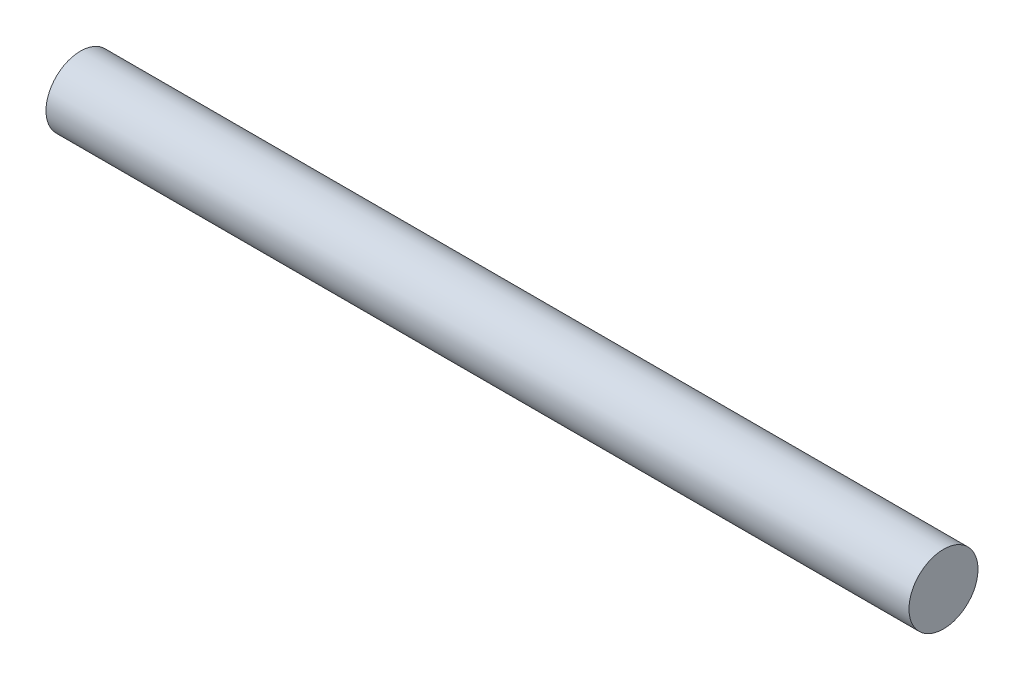
ISO-10303-21;
HEADER;
FILE_DESCRIPTION(('STEP AP214'),'2;1');
FILE_NAME('part.step','',(''),(''),'','','');
FILE_SCHEMA(('AUTOMOTIVE_DESIGN { 1 0 10303 214 1 1 1 1 }'));
ENDSEC;
DATA;
#1=APPLICATION_CONTEXT('core data for automotive mechanical design processes');
#2=APPLICATION_PROTOCOL_DEFINITION('international standard','automotive_design',2000,#1);
#3=PRODUCT_CONTEXT('',#1,'mechanical');
#4=PRODUCT('Part','Part','',(#3));
#5=PRODUCT_RELATED_PRODUCT_CATEGORY('part','',(#4));
#6=PRODUCT_DEFINITION_FORMATION('','',#4);
#7=PRODUCT_DEFINITION_CONTEXT('part definition',#1,'design');
#8=PRODUCT_DEFINITION('design','',#6,#7);
#9=PRODUCT_DEFINITION_SHAPE('','',#8);
#10=(LENGTH_UNIT() NAMED_UNIT(*) SI_UNIT(.MILLI.,.METRE.));
#11=(NAMED_UNIT(*) PLANE_ANGLE_UNIT() SI_UNIT($,.RADIAN.));
#12=(NAMED_UNIT(*) SI_UNIT($,.STERADIAN.) SOLID_ANGLE_UNIT());
#13=UNCERTAINTY_MEASURE_WITH_UNIT(LENGTH_MEASURE(1.E-05),#10,'distance_accuracy_value','');
#14=(GEOMETRIC_REPRESENTATION_CONTEXT(3) GLOBAL_UNCERTAINTY_ASSIGNED_CONTEXT((#13)) GLOBAL_UNIT_ASSIGNED_CONTEXT((#10,
#11,#12)) REPRESENTATION_CONTEXT('',''));
#15=CARTESIAN_POINT('',(0.,0.,0.));
#16=DIRECTION('',(0.,0.,1.));
#17=DIRECTION('',(1.,0.,0.));
#18=AXIS2_PLACEMENT_3D('',#15,#16,#17);
#19=CARTESIAN_POINT('',(269.983182014074,26.9456464433356,-290.557066165234));
#20=DIRECTION('',(-1.,0.,0.));
#21=DIRECTION('',(0.,-1.,0.));
#22=AXIS2_PLACEMENT_3D('',#19,#20,#21);
#23=CYLINDRICAL_SURFACE('',#22,3.99999999999999);
#24=CARTESIAN_POINT('',(269.983182014074,26.9456464433356,-290.557066165234));
#25=DIRECTION('',(1.,0.,0.));
#26=DIRECTION('',(0.,1.,0.));
#27=AXIS2_PLACEMENT_3D('',#24,#25,#26);
#28=CIRCLE('',#27,3.99999999999999);
#29=CARTESIAN_POINT('',(269.983182014074,30.9456464433356,-290.557066165234));
#30=VERTEX_POINT('',#29);
#31=EDGE_CURVE('E12',#30,#30,#28,.T.);
#32=ORIENTED_EDGE('',*,*,#31,.F.);
#33=EDGE_LOOP('',(#32));
#34=FACE_BOUND('',#33,.T.);
#35=CARTESIAN_POINT('',(169.983182014074,26.9456464433356,-290.557066165234));
#36=DIRECTION('',(1.,0.,0.));
#37=DIRECTION('',(0.,1.,0.));
#38=AXIS2_PLACEMENT_3D('',#35,#36,#37);
#39=CIRCLE('',#38,3.99999999999999);
#40=CARTESIAN_POINT('',(169.983182014074,30.9456464433356,-290.557066165234));
#41=VERTEX_POINT('',#40);
#42=EDGE_CURVE('E44',#41,#41,#39,.T.);
#43=ORIENTED_EDGE('',*,*,#42,.T.);
#44=EDGE_LOOP('',(#43));
#45=FACE_BOUND('',#44,.T.);
#46=ADVANCED_FACE('F41',(#34,#45),#23,.T.);
#47=CARTESIAN_POINT('',(269.983182014074,26.9456464433356,-290.557066165234));
#48=DIRECTION('',(1.,0.,0.));
#49=DIRECTION('',(0.,1.,0.));
#50=AXIS2_PLACEMENT_3D('',#47,#48,#49);
#51=PLANE('',#50);
#52=ORIENTED_EDGE('',*,*,#31,.T.);
#53=EDGE_LOOP('',(#52));
#54=FACE_BOUND('',#53,.T.);
#55=ADVANCED_FACE('F56',(#54),#51,.T.);
#56=CARTESIAN_POINT('',(169.983182014074,26.9456464433356,-290.557066165234));
#57=DIRECTION('',(1.,0.,0.));
#58=DIRECTION('',(0.,1.,0.));
#59=AXIS2_PLACEMENT_3D('',#56,#57,#58);
#60=PLANE('',#59);
#61=ORIENTED_EDGE('',*,*,#42,.F.);
#62=EDGE_LOOP('',(#61));
#63=FACE_BOUND('',#62,.T.);
#64=ADVANCED_FACE('F54',(#63),#60,.F.);
#65=CLOSED_SHELL('',(#46,#55,#64));
#66=MANIFOLD_SOLID_BREP('B2',#65);
#67=ADVANCED_BREP_SHAPE_REPRESENTATION('',(#18,#66),#14);
#68=SHAPE_DEFINITION_REPRESENTATION(#9,#67);
ENDSEC;
END-ISO-10303-21;
